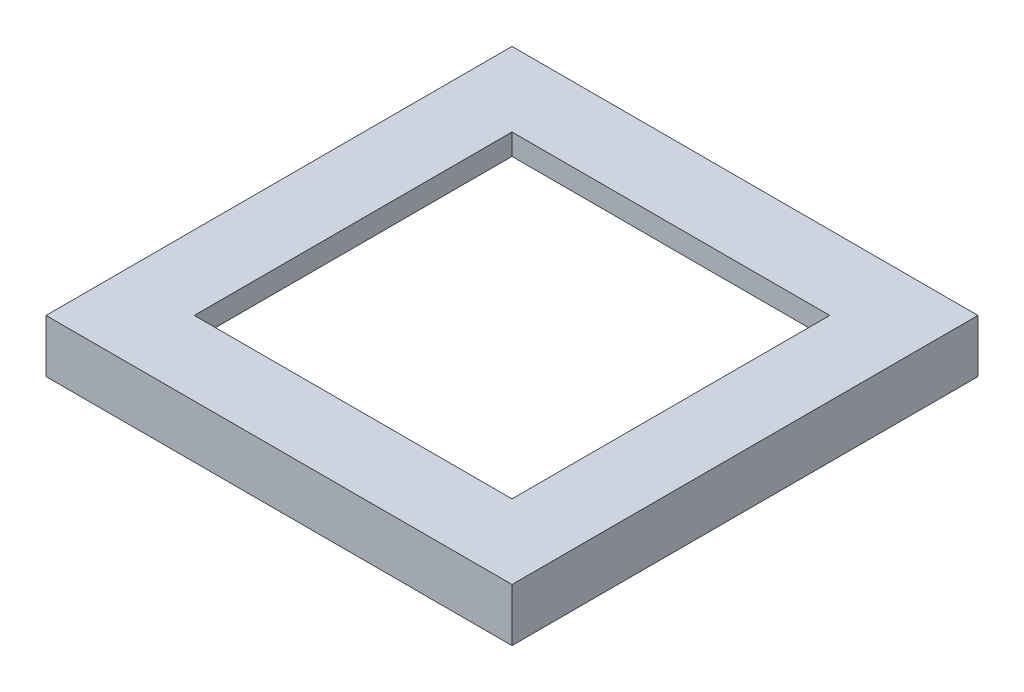
ISO-10303-21;
HEADER;
FILE_DESCRIPTION(('STEP AP214'),'2;1');
FILE_NAME('part.step','',(''),(''),'','','');
FILE_SCHEMA(('AUTOMOTIVE_DESIGN { 1 0 10303 214 1 1 1 1 }'));
ENDSEC;
DATA;
#1=APPLICATION_CONTEXT('core data for automotive mechanical design processes');
#2=APPLICATION_PROTOCOL_DEFINITION('international standard','automotive_design',2000,#1);
#3=PRODUCT_CONTEXT('',#1,'mechanical');
#4=PRODUCT('Part','Part','',(#3));
#5=PRODUCT_RELATED_PRODUCT_CATEGORY('part','',(#4));
#6=PRODUCT_DEFINITION_FORMATION('','',#4);
#7=PRODUCT_DEFINITION_CONTEXT('part definition',#1,'design');
#8=PRODUCT_DEFINITION('design','',#6,#7);
#9=PRODUCT_DEFINITION_SHAPE('','',#8);
#10=(LENGTH_UNIT() NAMED_UNIT(*) SI_UNIT(.MILLI.,.METRE.));
#11=(NAMED_UNIT(*) PLANE_ANGLE_UNIT() SI_UNIT($,.RADIAN.));
#12=(NAMED_UNIT(*) SI_UNIT($,.STERADIAN.) SOLID_ANGLE_UNIT());
#13=UNCERTAINTY_MEASURE_WITH_UNIT(LENGTH_MEASURE(1.E-05),#10,'distance_accuracy_value','');
#14=(GEOMETRIC_REPRESENTATION_CONTEXT(3) GLOBAL_UNCERTAINTY_ASSIGNED_CONTEXT((#13)) GLOBAL_UNIT_ASSIGNED_CONTEXT((#10,
#11,#12)) REPRESENTATION_CONTEXT('',''));
#15=CARTESIAN_POINT('',(0.,0.,0.));
#16=DIRECTION('',(0.,0.,1.));
#17=DIRECTION('',(1.,0.,0.));
#18=AXIS2_PLACEMENT_3D('',#15,#16,#17);
#19=CARTESIAN_POINT('',(-22.,5.,22.));
#20=DIRECTION('',(-1.,0.,0.));
#21=DIRECTION('',(0.,0.,1.));
#22=AXIS2_PLACEMENT_3D('',#19,#20,#21);
#23=PLANE('',#22);
#24=DIRECTION('',(0.,0.,-1.));
#25=VECTOR('',#24,1.);
#26=CARTESIAN_POINT('',(-22.,0.,22.));
#27=LINE('',#26,#25);
#28=CARTESIAN_POINT('',(-22.,0.,22.));
#29=VERTEX_POINT('',#28);
#30=CARTESIAN_POINT('',(-22.,0.,-22.));
#31=VERTEX_POINT('',#30);
#32=EDGE_CURVE('E210',#29,#31,#27,.T.);
#33=ORIENTED_EDGE('',*,*,#32,.F.);
#34=DIRECTION('',(0.,-1.,0.));
#35=VECTOR('',#34,1.);
#36=CARTESIAN_POINT('',(-22.,5.,22.));
#37=LINE('',#36,#35);
#38=CARTESIAN_POINT('',(-22.,5.,22.));
#39=VERTEX_POINT('',#38);
#40=EDGE_CURVE('E11',#39,#29,#37,.T.);
#41=ORIENTED_EDGE('',*,*,#40,.F.);
#42=DIRECTION('',(0.,0.,-1.));
#43=VECTOR('',#42,1.);
#44=CARTESIAN_POINT('',(-22.,5.,22.));
#45=LINE('',#44,#43);
#46=CARTESIAN_POINT('',(-22.,5.,-22.));
#47=VERTEX_POINT('',#46);
#48=EDGE_CURVE('E219',#39,#47,#45,.T.);
#49=ORIENTED_EDGE('',*,*,#48,.T.);
#50=DIRECTION('',(0.,-1.,0.));
#51=VECTOR('',#50,1.);
#52=CARTESIAN_POINT('',(-22.,5.,-22.));
#53=LINE('',#52,#51);
#54=EDGE_CURVE('E42',#47,#31,#53,.T.);
#55=ORIENTED_EDGE('',*,*,#54,.T.);
#56=EDGE_LOOP('',(#33,#41,#49,#55));
#57=FACE_BOUND('',#56,.T.);
#58=ADVANCED_FACE('F39',(#57),#23,.T.);
#59=CARTESIAN_POINT('',(-22.,5.,22.));
#60=DIRECTION('',(0.,0.,-1.));
#61=DIRECTION('',(-1.,0.,0.));
#62=AXIS2_PLACEMENT_3D('',#59,#60,#61);
#63=PLANE('',#62);
#64=DIRECTION('',(1.,0.,0.));
#65=VECTOR('',#64,1.);
#66=CARTESIAN_POINT('',(-22.,0.,22.));
#67=LINE('',#66,#65);
#68=CARTESIAN_POINT('',(22.,0.,22.));
#69=VERTEX_POINT('',#68);
#70=EDGE_CURVE('E224',#29,#69,#67,.T.);
#71=ORIENTED_EDGE('',*,*,#70,.T.);
#72=DIRECTION('',(0.,-1.,0.));
#73=VECTOR('',#72,1.);
#74=CARTESIAN_POINT('',(22.,5.,22.));
#75=LINE('',#74,#73);
#76=CARTESIAN_POINT('',(22.,5.,22.));
#77=VERTEX_POINT('',#76);
#78=EDGE_CURVE('E48',#77,#69,#75,.T.);
#79=ORIENTED_EDGE('',*,*,#78,.F.);
#80=DIRECTION('',(1.,0.,0.));
#81=VECTOR('',#80,1.);
#82=CARTESIAN_POINT('',(-22.,5.,22.));
#83=LINE('',#82,#81);
#84=EDGE_CURVE('E231',#39,#77,#83,.T.);
#85=ORIENTED_EDGE('',*,*,#84,.F.);
#86=ORIENTED_EDGE('',*,*,#40,.T.);
#87=EDGE_LOOP('',(#71,#79,#85,#86));
#88=FACE_BOUND('',#87,.T.);
#89=ADVANCED_FACE('F266',(#88),#63,.F.);
#90=CARTESIAN_POINT('',(22.,5.,22.));
#91=DIRECTION('',(-1.,0.,0.));
#92=DIRECTION('',(0.,0.,1.));
#93=AXIS2_PLACEMENT_3D('',#90,#91,#92);
#94=PLANE('',#93);
#95=DIRECTION('',(0.,0.,-1.));
#96=VECTOR('',#95,1.);
#97=CARTESIAN_POINT('',(22.,0.,22.));
#98=LINE('',#97,#96);
#99=CARTESIAN_POINT('',(22.,0.,-22.));
#100=VERTEX_POINT('',#99);
#101=EDGE_CURVE('E241',#69,#100,#98,.T.);
#102=ORIENTED_EDGE('',*,*,#101,.T.);
#103=DIRECTION('',(0.,-1.,0.));
#104=VECTOR('',#103,1.);
#105=CARTESIAN_POINT('',(22.,5.,-22.));
#106=LINE('',#105,#104);
#107=CARTESIAN_POINT('',(22.,5.,-22.));
#108=VERTEX_POINT('',#107);
#109=EDGE_CURVE('E249',#108,#100,#106,.T.);
#110=ORIENTED_EDGE('',*,*,#109,.F.);
#111=DIRECTION('',(0.,0.,-1.));
#112=VECTOR('',#111,1.);
#113=CARTESIAN_POINT('',(22.,5.,22.));
#114=LINE('',#113,#112);
#115=EDGE_CURVE('E228',#77,#108,#114,.T.);
#116=ORIENTED_EDGE('',*,*,#115,.F.);
#117=ORIENTED_EDGE('',*,*,#78,.T.);
#118=EDGE_LOOP('',(#102,#110,#116,#117));
#119=FACE_BOUND('',#118,.T.);
#120=ADVANCED_FACE('F270',(#119),#94,.F.);
#121=CARTESIAN_POINT('',(-22.,5.,-22.));
#122=DIRECTION('',(0.,0.,-1.));
#123=DIRECTION('',(-1.,0.,0.));
#124=AXIS2_PLACEMENT_3D('',#121,#122,#123);
#125=PLANE('',#124);
#126=DIRECTION('',(1.,0.,0.));
#127=VECTOR('',#126,1.);
#128=CARTESIAN_POINT('',(-22.,0.,-22.));
#129=LINE('',#128,#127);
#130=EDGE_CURVE('E237',#31,#100,#129,.T.);
#131=ORIENTED_EDGE('',*,*,#130,.F.);
#132=ORIENTED_EDGE('',*,*,#54,.F.);
#133=DIRECTION('',(1.,0.,0.));
#134=VECTOR('',#133,1.);
#135=CARTESIAN_POINT('',(-22.,5.,-22.));
#136=LINE('',#135,#134);
#137=EDGE_CURVE('E223',#47,#108,#136,.T.);
#138=ORIENTED_EDGE('',*,*,#137,.T.);
#139=ORIENTED_EDGE('',*,*,#109,.T.);
#140=EDGE_LOOP('',(#131,#132,#138,#139));
#141=FACE_BOUND('',#140,.T.);
#142=ADVANCED_FACE('F259',(#141),#125,.T.);
#143=CARTESIAN_POINT('',(0.,5.,0.));
#144=DIRECTION('',(0.,-1.,0.));
#145=DIRECTION('',(0.,0.,-1.));
#146=AXIS2_PLACEMENT_3D('',#143,#144,#145);
#147=PLANE('',#146);
#148=DIRECTION('',(-1.,0.,0.));
#149=VECTOR('',#148,1.);
#150=CARTESIAN_POINT('',(-15.,5.,-15.));
#151=LINE('',#150,#149);
#152=CARTESIAN_POINT('',(15.,5.,-15.));
#153=VERTEX_POINT('',#152);
#154=CARTESIAN_POINT('',(-15.,5.,-15.));
#155=VERTEX_POINT('',#154);
#156=EDGE_CURVE('E196',#153,#155,#151,.T.);
#157=ORIENTED_EDGE('',*,*,#156,.F.);
#158=DIRECTION('',(0.,0.,-1.));
#159=VECTOR('',#158,1.);
#160=CARTESIAN_POINT('',(15.,5.,15.));
#161=LINE('',#160,#159);
#162=CARTESIAN_POINT('',(15.,5.,15.));
#163=VERTEX_POINT('',#162);
#164=EDGE_CURVE('E64',#163,#153,#161,.T.);
#165=ORIENTED_EDGE('',*,*,#164,.F.);
#166=DIRECTION('',(1.,0.,0.));
#167=VECTOR('',#166,1.);
#168=CARTESIAN_POINT('',(-15.,5.,15.));
#169=LINE('',#168,#167);
#170=CARTESIAN_POINT('',(-15.,5.,15.));
#171=VERTEX_POINT('',#170);
#172=EDGE_CURVE('E184',#171,#163,#169,.T.);
#173=ORIENTED_EDGE('',*,*,#172,.F.);
#174=DIRECTION('',(0.,0.,1.));
#175=VECTOR('',#174,1.);
#176=CARTESIAN_POINT('',(-15.,5.,15.));
#177=LINE('',#176,#175);
#178=EDGE_CURVE('E200',#155,#171,#177,.T.);
#179=ORIENTED_EDGE('',*,*,#178,.F.);
#180=EDGE_LOOP('',(#157,#165,#173,#179));
#181=FACE_BOUND('',#180,.T.);
#182=ORIENTED_EDGE('',*,*,#48,.F.);
#183=ORIENTED_EDGE('',*,*,#84,.T.);
#184=ORIENTED_EDGE('',*,*,#115,.T.);
#185=ORIENTED_EDGE('',*,*,#137,.F.);
#186=EDGE_LOOP('',(#182,#183,#184,#185));
#187=FACE_BOUND('',#186,.T.);
#188=ADVANCED_FACE('F272',(#181,#187),#147,.F.);
#189=CARTESIAN_POINT('',(0.,0.,0.));
#190=DIRECTION('',(0.,-1.,0.));
#191=DIRECTION('',(0.,0.,-1.));
#192=AXIS2_PLACEMENT_3D('',#189,#190,#191);
#193=PLANE('',#192);
#194=DIRECTION('',(0.,0.,1.));
#195=VECTOR('',#194,1.);
#196=CARTESIAN_POINT('',(19.5,0.,-19.5));
#197=LINE('',#196,#195);
#198=CARTESIAN_POINT('',(19.5,0.,-19.5));
#199=VERTEX_POINT('',#198);
#200=CARTESIAN_POINT('',(19.5,0.,19.5));
#201=VERTEX_POINT('',#200);
#202=EDGE_CURVE('E56',#199,#201,#197,.T.);
#203=ORIENTED_EDGE('',*,*,#202,.F.);
#204=DIRECTION('',(1.,0.,0.));
#205=VECTOR('',#204,1.);
#206=CARTESIAN_POINT('',(-19.5,0.,-19.5));
#207=LINE('',#206,#205);
#208=CARTESIAN_POINT('',(-19.5,0.,-19.5));
#209=VERTEX_POINT('',#208);
#210=EDGE_CURVE('E153',#209,#199,#207,.T.);
#211=ORIENTED_EDGE('',*,*,#210,.F.);
#212=DIRECTION('',(0.,0.,-1.));
#213=VECTOR('',#212,1.);
#214=CARTESIAN_POINT('',(-19.5,0.,-19.5));
#215=LINE('',#214,#213);
#216=CARTESIAN_POINT('',(-19.5,0.,19.5));
#217=VERTEX_POINT('',#216);
#218=EDGE_CURVE('E157',#217,#209,#215,.T.);
#219=ORIENTED_EDGE('',*,*,#218,.F.);
#220=DIRECTION('',(-1.,0.,0.));
#221=VECTOR('',#220,1.);
#222=CARTESIAN_POINT('',(-19.5,0.,19.5));
#223=LINE('',#222,#221);
#224=EDGE_CURVE('E166',#201,#217,#223,.T.);
#225=ORIENTED_EDGE('',*,*,#224,.F.);
#226=EDGE_LOOP('',(#203,#211,#219,#225));
#227=FACE_BOUND('',#226,.T.);
#228=ORIENTED_EDGE('',*,*,#32,.T.);
#229=ORIENTED_EDGE('',*,*,#130,.T.);
#230=ORIENTED_EDGE('',*,*,#101,.F.);
#231=ORIENTED_EDGE('',*,*,#70,.F.);
#232=EDGE_LOOP('',(#228,#229,#230,#231));
#233=FACE_BOUND('',#232,.T.);
#234=ADVANCED_FACE('F263',(#227,#233),#193,.T.);
#235=CARTESIAN_POINT('',(15.,3.,15.));
#236=DIRECTION('',(1.,0.,0.));
#237=DIRECTION('',(0.,0.,-1.));
#238=AXIS2_PLACEMENT_3D('',#235,#236,#237);
#239=PLANE('',#238);
#240=ORIENTED_EDGE('',*,*,#164,.T.);
#241=DIRECTION('',(0.,1.,0.));
#242=VECTOR('',#241,1.);
#243=CARTESIAN_POINT('',(15.,3.,-15.));
#244=LINE('',#243,#242);
#245=CARTESIAN_POINT('',(15.,3.,-15.));
#246=VERTEX_POINT('',#245);
#247=EDGE_CURVE('E193',#246,#153,#244,.T.);
#248=ORIENTED_EDGE('',*,*,#247,.F.);
#249=DIRECTION('',(0.,0.,-1.));
#250=VECTOR('',#249,1.);
#251=CARTESIAN_POINT('',(15.,3.,15.));
#252=LINE('',#251,#250);
#253=CARTESIAN_POINT('',(15.,3.,15.));
#254=VERTEX_POINT('',#253);
#255=EDGE_CURVE('E180',#254,#246,#252,.T.);
#256=ORIENTED_EDGE('',*,*,#255,.F.);
#257=DIRECTION('',(0.,1.,0.));
#258=VECTOR('',#257,1.);
#259=CARTESIAN_POINT('',(15.,3.,15.));
#260=LINE('',#259,#258);
#261=EDGE_CURVE('E207',#254,#163,#260,.T.);
#262=ORIENTED_EDGE('',*,*,#261,.T.);
#263=EDGE_LOOP('',(#240,#248,#256,#262));
#264=FACE_BOUND('',#263,.T.);
#265=ADVANCED_FACE('F280',(#264),#239,.F.);
#266=CARTESIAN_POINT('',(-15.,3.,15.));
#267=DIRECTION('',(0.,0.,1.));
#268=DIRECTION('',(1.,0.,0.));
#269=AXIS2_PLACEMENT_3D('',#266,#267,#268);
#270=PLANE('',#269);
#271=ORIENTED_EDGE('',*,*,#172,.T.);
#272=ORIENTED_EDGE('',*,*,#261,.F.);
#273=DIRECTION('',(1.,0.,0.));
#274=VECTOR('',#273,1.);
#275=CARTESIAN_POINT('',(-15.,3.,15.));
#276=LINE('',#275,#274);
#277=CARTESIAN_POINT('',(-15.,3.,15.));
#278=VERTEX_POINT('',#277);
#279=EDGE_CURVE('E190',#278,#254,#276,.T.);
#280=ORIENTED_EDGE('',*,*,#279,.F.);
#281=DIRECTION('',(0.,1.,0.));
#282=VECTOR('',#281,1.);
#283=CARTESIAN_POINT('',(-15.,3.,15.));
#284=LINE('',#283,#282);
#285=EDGE_CURVE('E211',#278,#171,#284,.T.);
#286=ORIENTED_EDGE('',*,*,#285,.T.);
#287=EDGE_LOOP('',(#271,#272,#280,#286));
#288=FACE_BOUND('',#287,.T.);
#289=ADVANCED_FACE('F319',(#288),#270,.F.);
#290=CARTESIAN_POINT('',(-15.,3.,15.));
#291=DIRECTION('',(-1.,0.,0.));
#292=DIRECTION('',(0.,0.,1.));
#293=AXIS2_PLACEMENT_3D('',#290,#291,#292);
#294=PLANE('',#293);
#295=ORIENTED_EDGE('',*,*,#178,.T.);
#296=ORIENTED_EDGE('',*,*,#285,.F.);
#297=DIRECTION('',(0.,0.,1.));
#298=VECTOR('',#297,1.);
#299=CARTESIAN_POINT('',(-15.,3.,15.));
#300=LINE('',#299,#298);
#301=CARTESIAN_POINT('',(-15.,3.,-15.));
#302=VERTEX_POINT('',#301);
#303=EDGE_CURVE('E187',#302,#278,#300,.T.);
#304=ORIENTED_EDGE('',*,*,#303,.F.);
#305=DIRECTION('',(0.,1.,0.));
#306=VECTOR('',#305,1.);
#307=CARTESIAN_POINT('',(-15.,3.,-15.));
#308=LINE('',#307,#306);
#309=EDGE_CURVE('E214',#302,#155,#308,.T.);
#310=ORIENTED_EDGE('',*,*,#309,.T.);
#311=EDGE_LOOP('',(#295,#296,#304,#310));
#312=FACE_BOUND('',#311,.T.);
#313=ADVANCED_FACE('F327',(#312),#294,.F.);
#314=CARTESIAN_POINT('',(-15.,3.,-15.));
#315=DIRECTION('',(0.,0.,-1.));
#316=DIRECTION('',(-1.,0.,0.));
#317=AXIS2_PLACEMENT_3D('',#314,#315,#316);
#318=PLANE('',#317);
#319=ORIENTED_EDGE('',*,*,#156,.T.);
#320=ORIENTED_EDGE('',*,*,#309,.F.);
#321=DIRECTION('',(-1.,0.,0.));
#322=VECTOR('',#321,1.);
#323=CARTESIAN_POINT('',(-15.,3.,-15.));
#324=LINE('',#323,#322);
#325=EDGE_CURVE('E183',#246,#302,#324,.T.);
#326=ORIENTED_EDGE('',*,*,#325,.F.);
#327=ORIENTED_EDGE('',*,*,#247,.T.);
#328=EDGE_LOOP('',(#319,#320,#326,#327));
#329=FACE_BOUND('',#328,.T.);
#330=ADVANCED_FACE('F337',(#329),#318,.F.);
#331=CARTESIAN_POINT('',(19.5,3.,-19.5));
#332=DIRECTION('',(1.,0.,0.));
#333=DIRECTION('',(0.,0.,-1.));
#334=AXIS2_PLACEMENT_3D('',#331,#332,#333);
#335=PLANE('',#334);
#336=ORIENTED_EDGE('',*,*,#202,.T.);
#337=DIRECTION('',(0.,-1.,0.));
#338=VECTOR('',#337,1.);
#339=CARTESIAN_POINT('',(19.5,3.,19.5));
#340=LINE('',#339,#338);
#341=CARTESIAN_POINT('',(19.5,3.,19.5));
#342=VERTEX_POINT('',#341);
#343=EDGE_CURVE('E128',#342,#201,#340,.T.);
#344=ORIENTED_EDGE('',*,*,#343,.F.);
#345=DIRECTION('',(0.,0.,1.));
#346=VECTOR('',#345,1.);
#347=CARTESIAN_POINT('',(19.5,3.,-19.5));
#348=LINE('',#347,#346);
#349=CARTESIAN_POINT('',(19.5,3.,-19.5));
#350=VERTEX_POINT('',#349);
#351=EDGE_CURVE('E132',#350,#342,#348,.T.);
#352=ORIENTED_EDGE('',*,*,#351,.F.);
#353=DIRECTION('',(0.,-1.,0.));
#354=VECTOR('',#353,1.);
#355=CARTESIAN_POINT('',(19.5,3.,-19.5));
#356=LINE('',#355,#354);
#357=EDGE_CURVE('E172',#350,#199,#356,.T.);
#358=ORIENTED_EDGE('',*,*,#357,.T.);
#359=EDGE_LOOP('',(#336,#344,#352,#358));
#360=FACE_BOUND('',#359,.T.);
#361=ADVANCED_FACE('F130',(#360),#335,.F.);
#362=CARTESIAN_POINT('',(-19.5,3.,-19.5));
#363=DIRECTION('',(0.,0.,-1.));
#364=DIRECTION('',(-1.,0.,0.));
#365=AXIS2_PLACEMENT_3D('',#362,#363,#364);
#366=PLANE('',#365);
#367=ORIENTED_EDGE('',*,*,#210,.T.);
#368=ORIENTED_EDGE('',*,*,#357,.F.);
#369=DIRECTION('',(1.,0.,0.));
#370=VECTOR('',#369,1.);
#371=CARTESIAN_POINT('',(-19.5,3.,-19.5));
#372=LINE('',#371,#370);
#373=CARTESIAN_POINT('',(-19.5,3.,-19.5));
#374=VERTEX_POINT('',#373);
#375=EDGE_CURVE('E139',#374,#350,#372,.T.);
#376=ORIENTED_EDGE('',*,*,#375,.F.);
#377=DIRECTION('',(0.,-1.,0.));
#378=VECTOR('',#377,1.);
#379=CARTESIAN_POINT('',(-19.5,3.,-19.5));
#380=LINE('',#379,#378);
#381=EDGE_CURVE('E175',#374,#209,#380,.T.);
#382=ORIENTED_EDGE('',*,*,#381,.T.);
#383=EDGE_LOOP('',(#367,#368,#376,#382));
#384=FACE_BOUND('',#383,.T.);
#385=ADVANCED_FACE('F356',(#384),#366,.F.);
#386=CARTESIAN_POINT('',(-19.5,3.,-19.5));
#387=DIRECTION('',(-1.,0.,0.));
#388=DIRECTION('',(0.,0.,1.));
#389=AXIS2_PLACEMENT_3D('',#386,#387,#388);
#390=PLANE('',#389);
#391=ORIENTED_EDGE('',*,*,#218,.T.);
#392=ORIENTED_EDGE('',*,*,#381,.F.);
#393=DIRECTION('',(0.,0.,-1.));
#394=VECTOR('',#393,1.);
#395=CARTESIAN_POINT('',(-19.5,3.,-19.5));
#396=LINE('',#395,#394);
#397=CARTESIAN_POINT('',(-19.5,3.,19.5));
#398=VERTEX_POINT('',#397);
#399=EDGE_CURVE('E148',#398,#374,#396,.T.);
#400=ORIENTED_EDGE('',*,*,#399,.F.);
#401=DIRECTION('',(0.,-1.,0.));
#402=VECTOR('',#401,1.);
#403=CARTESIAN_POINT('',(-19.5,3.,19.5));
#404=LINE('',#403,#402);
#405=EDGE_CURVE('E138',#398,#217,#404,.T.);
#406=ORIENTED_EDGE('',*,*,#405,.T.);
#407=EDGE_LOOP('',(#391,#392,#400,#406));
#408=FACE_BOUND('',#407,.T.);
#409=ADVANCED_FACE('F365',(#408),#390,.F.);
#410=CARTESIAN_POINT('',(-19.5,3.,19.5));
#411=DIRECTION('',(0.,0.,1.));
#412=DIRECTION('',(1.,0.,0.));
#413=AXIS2_PLACEMENT_3D('',#410,#411,#412);
#414=PLANE('',#413);
#415=ORIENTED_EDGE('',*,*,#224,.T.);
#416=ORIENTED_EDGE('',*,*,#405,.F.);
#417=DIRECTION('',(-1.,0.,0.));
#418=VECTOR('',#417,1.);
#419=CARTESIAN_POINT('',(-19.5,3.,19.5));
#420=LINE('',#419,#418);
#421=EDGE_CURVE('E142',#342,#398,#420,.T.);
#422=ORIENTED_EDGE('',*,*,#421,.F.);
#423=ORIENTED_EDGE('',*,*,#343,.T.);
#424=EDGE_LOOP('',(#415,#416,#422,#423));
#425=FACE_BOUND('',#424,.T.);
#426=ADVANCED_FACE('F143',(#425),#414,.F.);
#427=CARTESIAN_POINT('',(0.,3.,0.));
#428=DIRECTION('',(0.,1.,0.));
#429=DIRECTION('',(0.,0.,1.));
#430=AXIS2_PLACEMENT_3D('',#427,#428,#429);
#431=PLANE('',#430);
#432=ORIENTED_EDGE('',*,*,#255,.T.);
#433=ORIENTED_EDGE('',*,*,#325,.T.);
#434=ORIENTED_EDGE('',*,*,#303,.T.);
#435=ORIENTED_EDGE('',*,*,#279,.T.);
#436=EDGE_LOOP('',(#432,#433,#434,#435));
#437=FACE_BOUND('',#436,.T.);
#438=ORIENTED_EDGE('',*,*,#351,.T.);
#439=ORIENTED_EDGE('',*,*,#421,.T.);
#440=ORIENTED_EDGE('',*,*,#399,.T.);
#441=ORIENTED_EDGE('',*,*,#375,.T.);
#442=EDGE_LOOP('',(#438,#439,#440,#441));
#443=FACE_BOUND('',#442,.T.);
#444=ADVANCED_FACE('F150',(#437,#443),#431,.F.);
#445=CLOSED_SHELL('',(#58,#89,#120,#142,#188,#234,#265,#289,#313,#330,#361,#385,#409,#426,#444));
#446=MANIFOLD_SOLID_BREP('B2',#445);
#447=ADVANCED_BREP_SHAPE_REPRESENTATION('',(#18,#446),#14);
#448=SHAPE_DEFINITION_REPRESENTATION(#9,#447);
ENDSEC;
END-ISO-10303-21;
